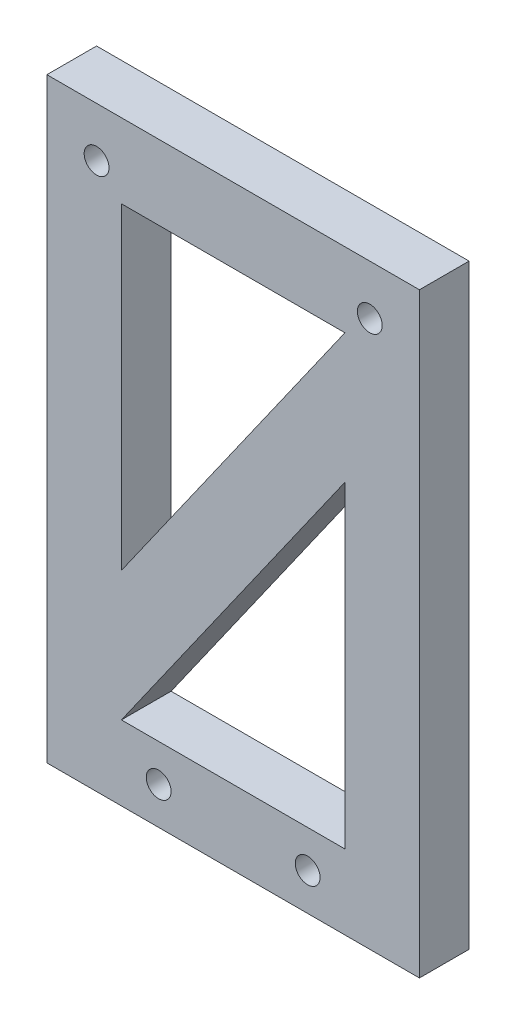
ISO-10303-21;
HEADER;
FILE_DESCRIPTION(('STEP AP214'),'2;1');
FILE_NAME('part.step','',(''),(''),'','','');
FILE_SCHEMA(('AUTOMOTIVE_DESIGN { 1 0 10303 214 1 1 1 1 }'));
ENDSEC;
DATA;
#1=APPLICATION_CONTEXT('core data for automotive mechanical design processes');
#2=APPLICATION_PROTOCOL_DEFINITION('international standard','automotive_design',2000,#1);
#3=PRODUCT_CONTEXT('',#1,'mechanical');
#4=PRODUCT('Part','Part','',(#3));
#5=PRODUCT_RELATED_PRODUCT_CATEGORY('part','',(#4));
#6=PRODUCT_DEFINITION_FORMATION('','',#4);
#7=PRODUCT_DEFINITION_CONTEXT('part definition',#1,'design');
#8=PRODUCT_DEFINITION('design','',#6,#7);
#9=PRODUCT_DEFINITION_SHAPE('','',#8);
#10=(LENGTH_UNIT() NAMED_UNIT(*) SI_UNIT(.MILLI.,.METRE.));
#11=(NAMED_UNIT(*) PLANE_ANGLE_UNIT() SI_UNIT($,.RADIAN.));
#12=(NAMED_UNIT(*) SI_UNIT($,.STERADIAN.) SOLID_ANGLE_UNIT());
#13=UNCERTAINTY_MEASURE_WITH_UNIT(LENGTH_MEASURE(1.E-05),#10,'distance_accuracy_value','');
#14=(GEOMETRIC_REPRESENTATION_CONTEXT(3) GLOBAL_UNCERTAINTY_ASSIGNED_CONTEXT((#13)) GLOBAL_UNIT_ASSIGNED_CONTEXT((#10,
#11,#12)) REPRESENTATION_CONTEXT('',''));
#15=CARTESIAN_POINT('',(0.,0.,0.));
#16=DIRECTION('',(0.,0.,1.));
#17=DIRECTION('',(1.,0.,0.));
#18=AXIS2_PLACEMENT_3D('',#15,#16,#17);
#19=CARTESIAN_POINT('',(0.,0.,-10.));
#20=DIRECTION('',(-1.,0.,0.));
#21=DIRECTION('',(0.,0.,1.));
#22=AXIS2_PLACEMENT_3D('',#19,#20,#21);
#23=PLANE('',#22);
#24=DIRECTION('',(0.,-1.,0.));
#25=VECTOR('',#24,1.);
#26=CARTESIAN_POINT('',(0.,0.,0.));
#27=LINE('',#26,#25);
#28=CARTESIAN_POINT('',(0.,120.,0.));
#29=VERTEX_POINT('',#28);
#30=CARTESIAN_POINT('',(0.,0.,0.));
#31=VERTEX_POINT('',#30);
#32=EDGE_CURVE('E188',#29,#31,#27,.T.);
#33=ORIENTED_EDGE('',*,*,#32,.F.);
#34=DIRECTION('',(0.,0.,1.));
#35=VECTOR('',#34,1.);
#36=CARTESIAN_POINT('',(0.,120.,-10.));
#37=LINE('',#36,#35);
#38=CARTESIAN_POINT('',(0.,120.,-10.));
#39=VERTEX_POINT('',#38);
#40=EDGE_CURVE('E11',#39,#29,#37,.T.);
#41=ORIENTED_EDGE('',*,*,#40,.F.);
#42=DIRECTION('',(0.,-1.,0.));
#43=VECTOR('',#42,1.);
#44=CARTESIAN_POINT('',(0.,0.,-10.));
#45=LINE('',#44,#43);
#46=CARTESIAN_POINT('',(0.,0.,-10.));
#47=VERTEX_POINT('',#46);
#48=EDGE_CURVE('E191',#39,#47,#45,.T.);
#49=ORIENTED_EDGE('',*,*,#48,.T.);
#50=DIRECTION('',(0.,0.,1.));
#51=VECTOR('',#50,1.);
#52=CARTESIAN_POINT('',(0.,0.,-10.));
#53=LINE('',#52,#51);
#54=EDGE_CURVE('E41',#47,#31,#53,.T.);
#55=ORIENTED_EDGE('',*,*,#54,.T.);
#56=EDGE_LOOP('',(#33,#41,#49,#55));
#57=FACE_BOUND('',#56,.T.);
#58=ADVANCED_FACE('F38',(#57),#23,.T.);
#59=CARTESIAN_POINT('',(0.,120.,-10.));
#60=DIRECTION('',(0.,1.,0.));
#61=DIRECTION('',(0.,0.,1.));
#62=AXIS2_PLACEMENT_3D('',#59,#60,#61);
#63=PLANE('',#62);
#64=DIRECTION('',(-1.,0.,0.));
#65=VECTOR('',#64,1.);
#66=CARTESIAN_POINT('',(0.,120.,0.));
#67=LINE('',#66,#65);
#68=CARTESIAN_POINT('',(75.,120.,0.));
#69=VERTEX_POINT('',#68);
#70=EDGE_CURVE('E195',#69,#29,#67,.T.);
#71=ORIENTED_EDGE('',*,*,#70,.F.);
#72=DIRECTION('',(0.,0.,1.));
#73=VECTOR('',#72,1.);
#74=CARTESIAN_POINT('',(75.,120.,-10.));
#75=LINE('',#74,#73);
#76=CARTESIAN_POINT('',(75.,120.,-10.));
#77=VERTEX_POINT('',#76);
#78=EDGE_CURVE('E46',#77,#69,#75,.T.);
#79=ORIENTED_EDGE('',*,*,#78,.F.);
#80=DIRECTION('',(-1.,0.,0.));
#81=VECTOR('',#80,1.);
#82=CARTESIAN_POINT('',(0.,120.,-10.));
#83=LINE('',#82,#81);
#84=EDGE_CURVE('E201',#77,#39,#83,.T.);
#85=ORIENTED_EDGE('',*,*,#84,.T.);
#86=ORIENTED_EDGE('',*,*,#40,.T.);
#87=EDGE_LOOP('',(#71,#79,#85,#86));
#88=FACE_BOUND('',#87,.T.);
#89=ADVANCED_FACE('F227',(#88),#63,.T.);
#90=CARTESIAN_POINT('',(75.,0.,-10.));
#91=DIRECTION('',(1.,0.,0.));
#92=DIRECTION('',(0.,0.,-1.));
#93=AXIS2_PLACEMENT_3D('',#90,#91,#92);
#94=PLANE('',#93);
#95=DIRECTION('',(0.,1.,0.));
#96=VECTOR('',#95,1.);
#97=CARTESIAN_POINT('',(75.,0.,0.));
#98=LINE('',#97,#96);
#99=CARTESIAN_POINT('',(75.,0.,0.));
#100=VERTEX_POINT('',#99);
#101=EDGE_CURVE('E209',#100,#69,#98,.T.);
#102=ORIENTED_EDGE('',*,*,#101,.F.);
#103=DIRECTION('',(0.,0.,1.));
#104=VECTOR('',#103,1.);
#105=CARTESIAN_POINT('',(75.,0.,-10.));
#106=LINE('',#105,#104);
#107=CARTESIAN_POINT('',(75.,0.,-10.));
#108=VERTEX_POINT('',#107);
#109=EDGE_CURVE('E214',#108,#100,#106,.T.);
#110=ORIENTED_EDGE('',*,*,#109,.F.);
#111=DIRECTION('',(0.,1.,0.));
#112=VECTOR('',#111,1.);
#113=CARTESIAN_POINT('',(75.,0.,-10.));
#114=LINE('',#113,#112);
#115=EDGE_CURVE('E198',#108,#77,#114,.T.);
#116=ORIENTED_EDGE('',*,*,#115,.T.);
#117=ORIENTED_EDGE('',*,*,#78,.T.);
#118=EDGE_LOOP('',(#102,#110,#116,#117));
#119=FACE_BOUND('',#118,.T.);
#120=ADVANCED_FACE('F232',(#119),#94,.T.);
#121=CARTESIAN_POINT('',(0.,0.,-10.));
#122=DIRECTION('',(0.,-1.,0.));
#123=DIRECTION('',(0.,0.,-1.));
#124=AXIS2_PLACEMENT_3D('',#121,#122,#123);
#125=PLANE('',#124);
#126=DIRECTION('',(1.,0.,0.));
#127=VECTOR('',#126,1.);
#128=CARTESIAN_POINT('',(0.,0.,0.));
#129=LINE('',#128,#127);
#130=EDGE_CURVE('E206',#31,#100,#129,.T.);
#131=ORIENTED_EDGE('',*,*,#130,.F.);
#132=ORIENTED_EDGE('',*,*,#54,.F.);
#133=DIRECTION('',(1.,0.,0.));
#134=VECTOR('',#133,1.);
#135=CARTESIAN_POINT('',(0.,0.,-10.));
#136=LINE('',#135,#134);
#137=EDGE_CURVE('E194',#47,#108,#136,.T.);
#138=ORIENTED_EDGE('',*,*,#137,.T.);
#139=ORIENTED_EDGE('',*,*,#109,.T.);
#140=EDGE_LOOP('',(#131,#132,#138,#139));
#141=FACE_BOUND('',#140,.T.);
#142=ADVANCED_FACE('F222',(#141),#125,.T.);
#143=CARTESIAN_POINT('',(0.,0.,-10.));
#144=DIRECTION('',(0.,0.,-1.));
#145=DIRECTION('',(-1.,0.,0.));
#146=AXIS2_PLACEMENT_3D('',#143,#144,#145);
#147=PLANE('',#146);
#148=DIRECTION('',(-0.575549972047386,-0.817766610761441,0.));
#149=VECTOR('',#148,1.);
#150=CARTESIAN_POINT('',(60.,78.9379711085017,-10.));
#151=LINE('',#150,#149);
#152=CARTESIAN_POINT('',(60.,78.9379711085017,-10.));
#153=VERTEX_POINT('',#152);
#154=CARTESIAN_POINT('',(15.0000000000001,15.,-10.));
#155=VERTEX_POINT('',#154);
#156=EDGE_CURVE('E117',#153,#155,#151,.T.);
#157=ORIENTED_EDGE('',*,*,#156,.T.);
#158=DIRECTION('',(1.,0.,0.));
#159=VECTOR('',#158,1.);
#160=CARTESIAN_POINT('',(15.0000000000001,15.,-10.));
#161=LINE('',#160,#159);
#162=CARTESIAN_POINT('',(60.,15.,-10.));
#163=VERTEX_POINT('',#162);
#164=EDGE_CURVE('E124',#155,#163,#161,.T.);
#165=ORIENTED_EDGE('',*,*,#164,.T.);
#166=DIRECTION('',(0.,1.,0.));
#167=VECTOR('',#166,1.);
#168=CARTESIAN_POINT('',(60.,15.,-10.));
#169=LINE('',#168,#167);
#170=EDGE_CURVE('E54',#163,#153,#169,.T.);
#171=ORIENTED_EDGE('',*,*,#170,.T.);
#172=EDGE_LOOP('',(#157,#165,#171));
#173=FACE_BOUND('',#172,.T.);
#174=DIRECTION('',(-1.,0.,0.));
#175=VECTOR('',#174,1.);
#176=CARTESIAN_POINT('',(60.,105.,-10.));
#177=LINE('',#176,#175);
#178=CARTESIAN_POINT('',(60.,105.,-10.));
#179=VERTEX_POINT('',#178);
#180=CARTESIAN_POINT('',(15.,105.,-10.));
#181=VERTEX_POINT('',#180);
#182=EDGE_CURVE('E143',#179,#181,#177,.T.);
#183=ORIENTED_EDGE('',*,*,#182,.T.);
#184=DIRECTION('',(0.,-1.,0.));
#185=VECTOR('',#184,1.);
#186=CARTESIAN_POINT('',(15.,105.,-10.));
#187=LINE('',#186,#185);
#188=CARTESIAN_POINT('',(15.,41.0620288914983,-10.));
#189=VERTEX_POINT('',#188);
#190=EDGE_CURVE('E146',#181,#189,#187,.T.);
#191=ORIENTED_EDGE('',*,*,#190,.T.);
#192=DIRECTION('',(0.575549972047387,0.81776661076144,0.));
#193=VECTOR('',#192,1.);
#194=CARTESIAN_POINT('',(15.,41.0620288914983,-10.));
#195=LINE('',#194,#193);
#196=EDGE_CURVE('E150',#189,#179,#195,.T.);
#197=ORIENTED_EDGE('',*,*,#196,.T.);
#198=EDGE_LOOP('',(#183,#191,#197));
#199=FACE_BOUND('',#198,.T.);
#200=CARTESIAN_POINT('',(65.,110.,-10.));
#201=DIRECTION('',(0.,0.,1.));
#202=DIRECTION('',(-1.,0.,0.));
#203=AXIS2_PLACEMENT_3D('',#200,#201,#202);
#204=CIRCLE('',#203,2.5);
#205=CARTESIAN_POINT('',(62.5,110.,-10.));
#206=VERTEX_POINT('',#205);
#207=EDGE_CURVE('E167',#206,#206,#204,.T.);
#208=ORIENTED_EDGE('',*,*,#207,.T.);
#209=EDGE_LOOP('',(#208));
#210=FACE_BOUND('',#209,.T.);
#211=CARTESIAN_POINT('',(52.5,7.5,-10.));
#212=DIRECTION('',(0.,0.,1.));
#213=DIRECTION('',(-1.,0.,0.));
#214=AXIS2_PLACEMENT_3D('',#211,#212,#213);
#215=CIRCLE('',#214,2.49999999999999);
#216=CARTESIAN_POINT('',(50.,7.5,-10.));
#217=VERTEX_POINT('',#216);
#218=EDGE_CURVE('E173',#217,#217,#215,.T.);
#219=ORIENTED_EDGE('',*,*,#218,.T.);
#220=EDGE_LOOP('',(#219));
#221=FACE_BOUND('',#220,.T.);
#222=CARTESIAN_POINT('',(22.5,7.49999999999999,-10.));
#223=DIRECTION('',(0.,0.,1.));
#224=DIRECTION('',(1.,0.,0.));
#225=AXIS2_PLACEMENT_3D('',#222,#223,#224);
#226=CIRCLE('',#225,2.5);
#227=CARTESIAN_POINT('',(25.,7.49999999999999,-10.));
#228=VERTEX_POINT('',#227);
#229=EDGE_CURVE('E179',#228,#228,#226,.T.);
#230=ORIENTED_EDGE('',*,*,#229,.T.);
#231=EDGE_LOOP('',(#230));
#232=FACE_BOUND('',#231,.T.);
#233=CARTESIAN_POINT('',(10.,110.,-10.));
#234=DIRECTION('',(0.,0.,1.));
#235=DIRECTION('',(1.,0.,0.));
#236=AXIS2_PLACEMENT_3D('',#233,#234,#235);
#237=CIRCLE('',#236,2.5);
#238=CARTESIAN_POINT('',(12.5,110.,-10.));
#239=VERTEX_POINT('',#238);
#240=EDGE_CURVE('E185',#239,#239,#237,.T.);
#241=ORIENTED_EDGE('',*,*,#240,.T.);
#242=EDGE_LOOP('',(#241));
#243=FACE_BOUND('',#242,.T.);
#244=ORIENTED_EDGE('',*,*,#48,.F.);
#245=ORIENTED_EDGE('',*,*,#84,.F.);
#246=ORIENTED_EDGE('',*,*,#115,.F.);
#247=ORIENTED_EDGE('',*,*,#137,.F.);
#248=EDGE_LOOP('',(#244,#245,#246,#247));
#249=FACE_BOUND('',#248,.T.);
#250=ADVANCED_FACE('F128',(#173,#199,#210,#221,#232,#243,#249),#147,.T.);
#251=CARTESIAN_POINT('',(0.,0.,0.));
#252=DIRECTION('',(0.,0.,-1.));
#253=DIRECTION('',(-1.,0.,0.));
#254=AXIS2_PLACEMENT_3D('',#251,#252,#253);
#255=PLANE('',#254);
#256=DIRECTION('',(1.,0.,0.));
#257=VECTOR('',#256,1.);
#258=CARTESIAN_POINT('',(15.0000000000001,15.,0.));
#259=LINE('',#258,#257);
#260=CARTESIAN_POINT('',(15.0000000000001,15.,0.));
#261=VERTEX_POINT('',#260);
#262=CARTESIAN_POINT('',(60.,15.,0.));
#263=VERTEX_POINT('',#262);
#264=EDGE_CURVE('E133',#261,#263,#259,.T.);
#265=ORIENTED_EDGE('',*,*,#264,.F.);
#266=DIRECTION('',(-0.575549972047386,-0.817766610761441,0.));
#267=VECTOR('',#266,1.);
#268=CARTESIAN_POINT('',(60.,78.9379711085017,0.));
#269=LINE('',#268,#267);
#270=CARTESIAN_POINT('',(60.,78.9379711085017,0.));
#271=VERTEX_POINT('',#270);
#272=EDGE_CURVE('E62',#271,#261,#269,.T.);
#273=ORIENTED_EDGE('',*,*,#272,.F.);
#274=DIRECTION('',(0.,1.,0.));
#275=VECTOR('',#274,1.);
#276=CARTESIAN_POINT('',(60.,15.,0.));
#277=LINE('',#276,#275);
#278=EDGE_CURVE('E130',#263,#271,#277,.T.);
#279=ORIENTED_EDGE('',*,*,#278,.F.);
#280=EDGE_LOOP('',(#265,#273,#279));
#281=FACE_BOUND('',#280,.T.);
#282=DIRECTION('',(0.,-1.,0.));
#283=VECTOR('',#282,1.);
#284=CARTESIAN_POINT('',(15.,105.,0.));
#285=LINE('',#284,#283);
#286=CARTESIAN_POINT('',(15.,105.,0.));
#287=VERTEX_POINT('',#286);
#288=CARTESIAN_POINT('',(15.,41.0620288914983,0.));
#289=VERTEX_POINT('',#288);
#290=EDGE_CURVE('E155',#287,#289,#285,.T.);
#291=ORIENTED_EDGE('',*,*,#290,.F.);
#292=DIRECTION('',(-1.,0.,0.));
#293=VECTOR('',#292,1.);
#294=CARTESIAN_POINT('',(60.,105.,0.));
#295=LINE('',#294,#293);
#296=CARTESIAN_POINT('',(60.,105.,0.));
#297=VERTEX_POINT('',#296);
#298=EDGE_CURVE('E141',#297,#287,#295,.T.);
#299=ORIENTED_EDGE('',*,*,#298,.F.);
#300=DIRECTION('',(0.575549972047387,0.81776661076144,0.));
#301=VECTOR('',#300,1.);
#302=CARTESIAN_POINT('',(15.,41.0620288914983,0.));
#303=LINE('',#302,#301);
#304=EDGE_CURVE('E147',#289,#297,#303,.T.);
#305=ORIENTED_EDGE('',*,*,#304,.F.);
#306=EDGE_LOOP('',(#291,#299,#305));
#307=FACE_BOUND('',#306,.T.);
#308=CARTESIAN_POINT('',(65.,110.,0.));
#309=DIRECTION('',(0.,0.,1.));
#310=DIRECTION('',(-1.,0.,0.));
#311=AXIS2_PLACEMENT_3D('',#308,#309,#310);
#312=CIRCLE('',#311,2.5);
#313=CARTESIAN_POINT('',(62.5,110.,0.));
#314=VERTEX_POINT('',#313);
#315=EDGE_CURVE('E162',#314,#314,#312,.T.);
#316=ORIENTED_EDGE('',*,*,#315,.F.);
#317=EDGE_LOOP('',(#316));
#318=FACE_BOUND('',#317,.T.);
#319=CARTESIAN_POINT('',(52.5,7.5,0.));
#320=DIRECTION('',(0.,0.,1.));
#321=DIRECTION('',(-1.,0.,0.));
#322=AXIS2_PLACEMENT_3D('',#319,#320,#321);
#323=CIRCLE('',#322,2.49999999999999);
#324=CARTESIAN_POINT('',(50.,7.5,0.));
#325=VERTEX_POINT('',#324);
#326=EDGE_CURVE('E170',#325,#325,#323,.T.);
#327=ORIENTED_EDGE('',*,*,#326,.F.);
#328=EDGE_LOOP('',(#327));
#329=FACE_BOUND('',#328,.T.);
#330=CARTESIAN_POINT('',(22.5,7.49999999999999,0.));
#331=DIRECTION('',(0.,0.,1.));
#332=DIRECTION('',(1.,0.,0.));
#333=AXIS2_PLACEMENT_3D('',#330,#331,#332);
#334=CIRCLE('',#333,2.5);
#335=CARTESIAN_POINT('',(25.,7.49999999999999,0.));
#336=VERTEX_POINT('',#335);
#337=EDGE_CURVE('E176',#336,#336,#334,.T.);
#338=ORIENTED_EDGE('',*,*,#337,.F.);
#339=EDGE_LOOP('',(#338));
#340=FACE_BOUND('',#339,.T.);
#341=CARTESIAN_POINT('',(10.,110.,0.));
#342=DIRECTION('',(0.,0.,1.));
#343=DIRECTION('',(1.,0.,0.));
#344=AXIS2_PLACEMENT_3D('',#341,#342,#343);
#345=CIRCLE('',#344,2.5);
#346=CARTESIAN_POINT('',(12.5,110.,0.));
#347=VERTEX_POINT('',#346);
#348=EDGE_CURVE('E182',#347,#347,#345,.T.);
#349=ORIENTED_EDGE('',*,*,#348,.F.);
#350=EDGE_LOOP('',(#349));
#351=FACE_BOUND('',#350,.T.);
#352=ORIENTED_EDGE('',*,*,#32,.T.);
#353=ORIENTED_EDGE('',*,*,#130,.T.);
#354=ORIENTED_EDGE('',*,*,#101,.T.);
#355=ORIENTED_EDGE('',*,*,#70,.T.);
#356=EDGE_LOOP('',(#352,#353,#354,#355));
#357=FACE_BOUND('',#356,.T.);
#358=ADVANCED_FACE('F224',(#281,#307,#318,#329,#340,#351,#357),#255,.F.);
#359=CARTESIAN_POINT('',(10.,110.,-10.));
#360=DIRECTION('',(0.,0.,1.));
#361=DIRECTION('',(1.,0.,0.));
#362=AXIS2_PLACEMENT_3D('',#359,#360,#361);
#363=CYLINDRICAL_SURFACE('',#362,2.5);
#364=ORIENTED_EDGE('',*,*,#240,.F.);
#365=EDGE_LOOP('',(#364));
#366=FACE_BOUND('',#365,.T.);
#367=ORIENTED_EDGE('',*,*,#348,.T.);
#368=EDGE_LOOP('',(#367));
#369=FACE_BOUND('',#368,.T.);
#370=ADVANCED_FACE('F278',(#366,#369),#363,.F.);
#371=CARTESIAN_POINT('',(22.5,7.49999999999999,-10.));
#372=DIRECTION('',(0.,0.,1.));
#373=DIRECTION('',(1.,0.,0.));
#374=AXIS2_PLACEMENT_3D('',#371,#372,#373);
#375=CYLINDRICAL_SURFACE('',#374,2.5);
#376=ORIENTED_EDGE('',*,*,#229,.F.);
#377=EDGE_LOOP('',(#376));
#378=FACE_BOUND('',#377,.T.);
#379=ORIENTED_EDGE('',*,*,#337,.T.);
#380=EDGE_LOOP('',(#379));
#381=FACE_BOUND('',#380,.T.);
#382=ADVANCED_FACE('F289',(#378,#381),#375,.F.);
#383=CARTESIAN_POINT('',(52.5,7.5,-10.));
#384=DIRECTION('',(0.,0.,1.));
#385=DIRECTION('',(1.,0.,0.));
#386=AXIS2_PLACEMENT_3D('',#383,#384,#385);
#387=CYLINDRICAL_SURFACE('',#386,2.49999999999999);
#388=ORIENTED_EDGE('',*,*,#218,.F.);
#389=EDGE_LOOP('',(#388));
#390=FACE_BOUND('',#389,.T.);
#391=ORIENTED_EDGE('',*,*,#326,.T.);
#392=EDGE_LOOP('',(#391));
#393=FACE_BOUND('',#392,.T.);
#394=ADVANCED_FACE('F300',(#390,#393),#387,.F.);
#395=CARTESIAN_POINT('',(65.,110.,-10.));
#396=DIRECTION('',(0.,0.,1.));
#397=DIRECTION('',(1.,0.,0.));
#398=AXIS2_PLACEMENT_3D('',#395,#396,#397);
#399=CYLINDRICAL_SURFACE('',#398,2.5);
#400=ORIENTED_EDGE('',*,*,#207,.F.);
#401=EDGE_LOOP('',(#400));
#402=FACE_BOUND('',#401,.T.);
#403=ORIENTED_EDGE('',*,*,#315,.T.);
#404=EDGE_LOOP('',(#403));
#405=FACE_BOUND('',#404,.T.);
#406=ADVANCED_FACE('F311',(#402,#405),#399,.F.);
#407=CARTESIAN_POINT('',(60.,105.,-10.));
#408=DIRECTION('',(0.,1.,0.));
#409=DIRECTION('',(0.,0.,1.));
#410=AXIS2_PLACEMENT_3D('',#407,#408,#409);
#411=PLANE('',#410);
#412=ORIENTED_EDGE('',*,*,#298,.T.);
#413=DIRECTION('',(0.,0.,1.));
#414=VECTOR('',#413,1.);
#415=CARTESIAN_POINT('',(15.,105.,-10.));
#416=LINE('',#415,#414);
#417=EDGE_CURVE('E153',#181,#287,#416,.T.);
#418=ORIENTED_EDGE('',*,*,#417,.F.);
#419=ORIENTED_EDGE('',*,*,#182,.F.);
#420=DIRECTION('',(0.,0.,1.));
#421=VECTOR('',#420,1.);
#422=CARTESIAN_POINT('',(60.,105.,-10.));
#423=LINE('',#422,#421);
#424=EDGE_CURVE('E160',#179,#297,#423,.T.);
#425=ORIENTED_EDGE('',*,*,#424,.T.);
#426=EDGE_LOOP('',(#412,#418,#419,#425));
#427=FACE_BOUND('',#426,.T.);
#428=ADVANCED_FACE('F322',(#427),#411,.F.);
#429=CARTESIAN_POINT('',(15.,41.0620288914983,-10.));
#430=DIRECTION('',(0.81776661076144,-0.575549972047387,0.));
#431=DIRECTION('',(0.575549972047387,0.81776661076144,0.));
#432=AXIS2_PLACEMENT_3D('',#429,#430,#431);
#433=PLANE('',#432);
#434=ORIENTED_EDGE('',*,*,#304,.T.);
#435=ORIENTED_EDGE('',*,*,#424,.F.);
#436=ORIENTED_EDGE('',*,*,#196,.F.);
#437=DIRECTION('',(0.,0.,1.));
#438=VECTOR('',#437,1.);
#439=CARTESIAN_POINT('',(15.,41.0620288914983,-10.));
#440=LINE('',#439,#438);
#441=EDGE_CURVE('E163',#189,#289,#440,.T.);
#442=ORIENTED_EDGE('',*,*,#441,.T.);
#443=EDGE_LOOP('',(#434,#435,#436,#442));
#444=FACE_BOUND('',#443,.T.);
#445=ADVANCED_FACE('F333',(#444),#433,.F.);
#446=CARTESIAN_POINT('',(15.,105.,-10.));
#447=DIRECTION('',(-1.,0.,0.));
#448=DIRECTION('',(0.,0.,1.));
#449=AXIS2_PLACEMENT_3D('',#446,#447,#448);
#450=PLANE('',#449);
#451=ORIENTED_EDGE('',*,*,#290,.T.);
#452=ORIENTED_EDGE('',*,*,#441,.F.);
#453=ORIENTED_EDGE('',*,*,#190,.F.);
#454=ORIENTED_EDGE('',*,*,#417,.T.);
#455=EDGE_LOOP('',(#451,#452,#453,#454));
#456=FACE_BOUND('',#455,.T.);
#457=ADVANCED_FACE('F344',(#456),#450,.F.);
#458=CARTESIAN_POINT('',(60.,78.9379711085017,-10.));
#459=DIRECTION('',(-0.817766610761441,0.575549972047386,0.));
#460=DIRECTION('',(-0.575549972047386,-0.817766610761441,0.));
#461=AXIS2_PLACEMENT_3D('',#458,#459,#460);
#462=PLANE('',#461);
#463=ORIENTED_EDGE('',*,*,#272,.T.);
#464=DIRECTION('',(0.,0.,1.));
#465=VECTOR('',#464,1.);
#466=CARTESIAN_POINT('',(15.0000000000001,15.,-10.));
#467=LINE('',#466,#465);
#468=EDGE_CURVE('E113',#155,#261,#467,.T.);
#469=ORIENTED_EDGE('',*,*,#468,.F.);
#470=ORIENTED_EDGE('',*,*,#156,.F.);
#471=DIRECTION('',(0.,0.,1.));
#472=VECTOR('',#471,1.);
#473=CARTESIAN_POINT('',(60.,78.9379711085017,-10.));
#474=LINE('',#473,#472);
#475=EDGE_CURVE('E139',#153,#271,#474,.T.);
#476=ORIENTED_EDGE('',*,*,#475,.T.);
#477=EDGE_LOOP('',(#463,#469,#470,#476));
#478=FACE_BOUND('',#477,.T.);
#479=ADVANCED_FACE('F115',(#478),#462,.F.);
#480=CARTESIAN_POINT('',(60.,15.,-10.));
#481=DIRECTION('',(1.,0.,0.));
#482=DIRECTION('',(0.,0.,-1.));
#483=AXIS2_PLACEMENT_3D('',#480,#481,#482);
#484=PLANE('',#483);
#485=ORIENTED_EDGE('',*,*,#278,.T.);
#486=ORIENTED_EDGE('',*,*,#475,.F.);
#487=ORIENTED_EDGE('',*,*,#170,.F.);
#488=DIRECTION('',(0.,0.,1.));
#489=VECTOR('',#488,1.);
#490=CARTESIAN_POINT('',(60.,15.,-10.));
#491=LINE('',#490,#489);
#492=EDGE_CURVE('E121',#163,#263,#491,.T.);
#493=ORIENTED_EDGE('',*,*,#492,.T.);
#494=EDGE_LOOP('',(#485,#486,#487,#493));
#495=FACE_BOUND('',#494,.T.);
#496=ADVANCED_FACE('F365',(#495),#484,.F.);
#497=CARTESIAN_POINT('',(15.0000000000001,15.,-10.));
#498=DIRECTION('',(0.,-1.,0.));
#499=DIRECTION('',(0.,0.,-1.));
#500=AXIS2_PLACEMENT_3D('',#497,#498,#499);
#501=PLANE('',#500);
#502=ORIENTED_EDGE('',*,*,#264,.T.);
#503=ORIENTED_EDGE('',*,*,#492,.F.);
#504=ORIENTED_EDGE('',*,*,#164,.F.);
#505=ORIENTED_EDGE('',*,*,#468,.T.);
#506=EDGE_LOOP('',(#502,#503,#504,#505));
#507=FACE_BOUND('',#506,.T.);
#508=ADVANCED_FACE('F125',(#507),#501,.F.);
#509=CLOSED_SHELL('',(#58,#89,#120,#142,#250,#358,#370,#382,#394,#406,#428,#445,#457,#479,#496,#508));
#510=MANIFOLD_SOLID_BREP('B2',#509);
#511=ADVANCED_BREP_SHAPE_REPRESENTATION('',(#18,#510),#14);
#512=SHAPE_DEFINITION_REPRESENTATION(#9,#511);
ENDSEC;
END-ISO-10303-21;
